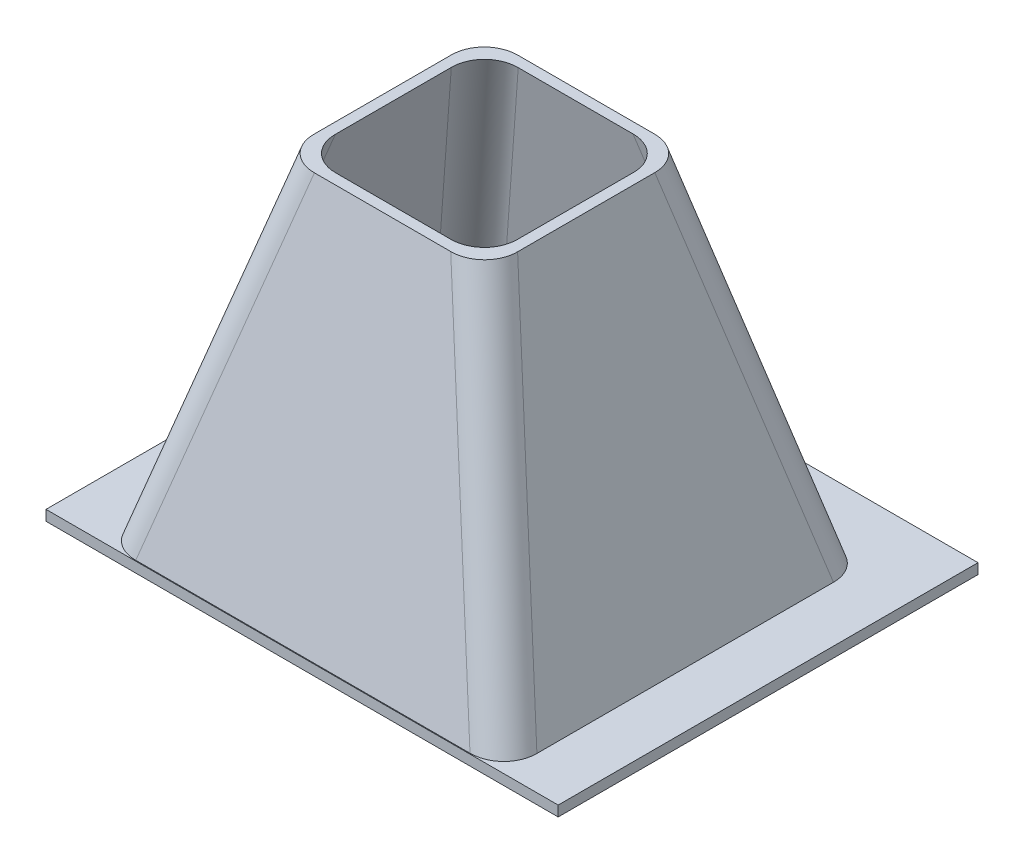
ISO-10303-21;
HEADER;
FILE_DESCRIPTION(('STEP AP214'),'2;1');
FILE_NAME('part.step','',(''),(''),'','','');
FILE_SCHEMA(('AUTOMOTIVE_DESIGN { 1 0 10303 214 1 1 1 1 }'));
ENDSEC;
DATA;
#1=APPLICATION_CONTEXT('core data for automotive mechanical design processes');
#2=APPLICATION_PROTOCOL_DEFINITION('international standard','automotive_design',2000,#1);
#3=PRODUCT_CONTEXT('',#1,'mechanical');
#4=PRODUCT('Part','Part','',(#3));
#5=PRODUCT_RELATED_PRODUCT_CATEGORY('part','',(#4));
#6=PRODUCT_DEFINITION_FORMATION('','',#4);
#7=PRODUCT_DEFINITION_CONTEXT('part definition',#1,'design');
#8=PRODUCT_DEFINITION('design','',#6,#7);
#9=PRODUCT_DEFINITION_SHAPE('','',#8);
#10=(LENGTH_UNIT() NAMED_UNIT(*) SI_UNIT(.MILLI.,.METRE.));
#11=(NAMED_UNIT(*) PLANE_ANGLE_UNIT() SI_UNIT($,.RADIAN.));
#12=(NAMED_UNIT(*) SI_UNIT($,.STERADIAN.) SOLID_ANGLE_UNIT());
#13=UNCERTAINTY_MEASURE_WITH_UNIT(LENGTH_MEASURE(1.E-05),#10,'distance_accuracy_value','');
#14=(GEOMETRIC_REPRESENTATION_CONTEXT(3) GLOBAL_UNCERTAINTY_ASSIGNED_CONTEXT((#13)) GLOBAL_UNIT_ASSIGNED_CONTEXT((#10,
#11,#12)) REPRESENTATION_CONTEXT('',''));
#15=CARTESIAN_POINT('',(0.,0.,0.));
#16=DIRECTION('',(0.,0.,1.));
#17=DIRECTION('',(1.,0.,0.));
#18=AXIS2_PLACEMENT_3D('',#15,#16,#17);
#19=CARTESIAN_POINT('',(0.,0.,0.));
#20=DIRECTION('',(0.,-1.,0.));
#21=DIRECTION('',(0.,0.,-1.));
#22=AXIS2_PLACEMENT_3D('',#19,#20,#21);
#23=PLANE('',#22);
#24=DIRECTION('',(-1.,0.,0.));
#25=VECTOR('',#24,1.);
#26=CARTESIAN_POINT('',(-29.5,0.,-29.5));
#27=LINE('',#26,#25);
#28=CARTESIAN_POINT('',(19.7420424099308,0.,-29.5));
#29=VERTEX_POINT('',#28);
#30=CARTESIAN_POINT('',(-19.7420424099308,0.,-29.5));
#31=VERTEX_POINT('',#30);
#32=EDGE_CURVE('E285',#29,#31,#27,.T.);
#33=ORIENTED_EDGE('',*,*,#32,.T.);
#34=CARTESIAN_POINT('',(-19.097005641384,0.,-19.2369589220661));
#35=DIRECTION('',(0.,-1.,0.));
#36=DIRECTION('',(0.778914652957355,0.,0.627129941406343));
#37=AXIS2_PLACEMENT_3D('',#34,#35,#36);
#38=ELLIPSE('',#37,10.656092332218,10.);
#39=CARTESIAN_POINT('',(-29.5,0.,-19.8733178995071));
#40=VERTEX_POINT('',#39);
#41=EDGE_CURVE('E329',#31,#40,#38,.F.);
#42=ORIENTED_EDGE('',*,*,#41,.T.);
#43=DIRECTION('',(0.,0.,1.));
#44=VECTOR('',#43,1.);
#45=CARTESIAN_POINT('',(-29.5,0.,29.5));
#46=LINE('',#45,#44);
#47=CARTESIAN_POINT('',(-29.5,0.,19.8733178995071));
#48=VERTEX_POINT('',#47);
#49=EDGE_CURVE('E289',#40,#48,#46,.T.);
#50=ORIENTED_EDGE('',*,*,#49,.T.);
#51=CARTESIAN_POINT('',(-19.097005641384,0.,19.2369589220661));
#52=DIRECTION('',(0.,-1.,0.));
#53=DIRECTION('',(0.778914652957355,0.,-0.627129941406343));
#54=AXIS2_PLACEMENT_3D('',#51,#52,#53);
#55=ELLIPSE('',#54,10.656092332218,10.);
#56=CARTESIAN_POINT('',(-19.7420424099308,0.,29.5));
#57=VERTEX_POINT('',#56);
#58=EDGE_CURVE('E320',#48,#57,#55,.F.);
#59=ORIENTED_EDGE('',*,*,#58,.T.);
#60=DIRECTION('',(1.,0.,0.));
#61=VECTOR('',#60,1.);
#62=CARTESIAN_POINT('',(-29.5,0.,29.5));
#63=LINE('',#62,#61);
#64=CARTESIAN_POINT('',(19.7420424099308,0.,29.5));
#65=VERTEX_POINT('',#64);
#66=EDGE_CURVE('E293',#57,#65,#63,.T.);
#67=ORIENTED_EDGE('',*,*,#66,.T.);
#68=CARTESIAN_POINT('',(19.097005641384,0.,19.2369589220661));
#69=DIRECTION('',(0.,-1.,0.));
#70=DIRECTION('',(-0.778914652957355,0.,-0.627129941406343));
#71=AXIS2_PLACEMENT_3D('',#68,#69,#70);
#72=ELLIPSE('',#71,10.656092332218,10.);
#73=CARTESIAN_POINT('',(29.5,0.,19.8733178995071));
#74=VERTEX_POINT('',#73);
#75=EDGE_CURVE('E323',#65,#74,#72,.F.);
#76=ORIENTED_EDGE('',*,*,#75,.T.);
#77=DIRECTION('',(0.,0.,-1.));
#78=VECTOR('',#77,1.);
#79=CARTESIAN_POINT('',(29.5,0.,29.5));
#80=LINE('',#79,#78);
#81=CARTESIAN_POINT('',(29.5,0.,-19.8733178995071));
#82=VERTEX_POINT('',#81);
#83=EDGE_CURVE('E260',#74,#82,#80,.T.);
#84=ORIENTED_EDGE('',*,*,#83,.T.);
#85=CARTESIAN_POINT('',(19.097005641384,0.,-19.2369589220661));
#86=DIRECTION('',(0.,-1.,0.));
#87=DIRECTION('',(-0.778914652957355,0.,0.627129941406343));
#88=AXIS2_PLACEMENT_3D('',#85,#86,#87);
#89=ELLIPSE('',#88,10.656092332218,10.);
#90=EDGE_CURVE('E326',#82,#29,#89,.F.);
#91=ORIENTED_EDGE('',*,*,#90,.T.);
#92=EDGE_LOOP('',(#33,#42,#50,#59,#67,#76,#84,#91));
#93=FACE_BOUND('',#92,.T.);
#94=DIRECTION('',(0.,0.,-1.));
#95=VECTOR('',#94,1.);
#96=CARTESIAN_POINT('',(26.3791016924152,0.,29.5));
#97=LINE('',#96,#95);
#98=CARTESIAN_POINT('',(26.3791016924152,0.,16.7944055761269));
#99=VERTEX_POINT('',#98);
#100=CARTESIAN_POINT('',(26.3791016924152,0.,-16.7944055761269));
#101=VERTEX_POINT('',#100);
#102=EDGE_CURVE('E249',#99,#101,#97,.T.);
#103=ORIENTED_EDGE('',*,*,#102,.F.);
#104=CARTESIAN_POINT('',(15.9761073337992,0.,16.1580465986859));
#105=DIRECTION('',(0.,-1.,0.));
#106=DIRECTION('',(0.778914652957355,0.,0.627129941406343));
#107=AXIS2_PLACEMENT_3D('',#104,#105,#106);
#108=ELLIPSE('',#107,10.656092332218,10.);
#109=CARTESIAN_POINT('',(16.621144102346,0.,26.4210876766198));
#110=VERTEX_POINT('',#109);
#111=EDGE_CURVE('E411',#99,#110,#108,.T.);
#112=ORIENTED_EDGE('',*,*,#111,.T.);
#113=DIRECTION('',(1.,0.,0.));
#114=VECTOR('',#113,1.);
#115=CARTESIAN_POINT('',(-29.5,0.,26.4210876766198));
#116=LINE('',#115,#114);
#117=CARTESIAN_POINT('',(-16.621144102346,0.,26.4210876766198));
#118=VERTEX_POINT('',#117);
#119=EDGE_CURVE('E255',#118,#110,#116,.T.);
#120=ORIENTED_EDGE('',*,*,#119,.F.);
#121=CARTESIAN_POINT('',(-15.9761073337992,0.,16.1580465986859));
#122=DIRECTION('',(0.,-1.,0.));
#123=DIRECTION('',(-0.778914652957355,0.,0.627129941406343));
#124=AXIS2_PLACEMENT_3D('',#121,#122,#123);
#125=ELLIPSE('',#124,10.656092332218,10.);
#126=CARTESIAN_POINT('',(-26.3791016924152,0.,16.7944055761269));
#127=VERTEX_POINT('',#126);
#128=EDGE_CURVE('E48',#118,#127,#125,.T.);
#129=ORIENTED_EDGE('',*,*,#128,.T.);
#130=DIRECTION('',(0.,0.,1.));
#131=VECTOR('',#130,1.);
#132=CARTESIAN_POINT('',(-26.3791016924152,0.,29.5));
#133=LINE('',#132,#131);
#134=CARTESIAN_POINT('',(-26.3791016924152,0.,-16.7944055761269));
#135=VERTEX_POINT('',#134);
#136=EDGE_CURVE('E275',#135,#127,#133,.T.);
#137=ORIENTED_EDGE('',*,*,#136,.F.);
#138=CARTESIAN_POINT('',(-15.9761073337992,0.,-16.1580465986859));
#139=DIRECTION('',(0.,-1.,0.));
#140=DIRECTION('',(-0.778914652957355,0.,-0.627129941406343));
#141=AXIS2_PLACEMENT_3D('',#138,#139,#140);
#142=ELLIPSE('',#141,10.656092332218,10.);
#143=CARTESIAN_POINT('',(-16.621144102346,0.,-26.4210876766198));
#144=VERTEX_POINT('',#143);
#145=EDGE_CURVE('E429',#135,#144,#142,.T.);
#146=ORIENTED_EDGE('',*,*,#145,.T.);
#147=DIRECTION('',(-1.,0.,0.));
#148=VECTOR('',#147,1.);
#149=CARTESIAN_POINT('',(-29.5,0.,-26.4210876766198));
#150=LINE('',#149,#148);
#151=CARTESIAN_POINT('',(16.621144102346,0.,-26.4210876766198));
#152=VERTEX_POINT('',#151);
#153=EDGE_CURVE('E271',#152,#144,#150,.T.);
#154=ORIENTED_EDGE('',*,*,#153,.F.);
#155=CARTESIAN_POINT('',(15.9761073337992,0.,-16.1580465986859));
#156=DIRECTION('',(0.,-1.,0.));
#157=DIRECTION('',(0.778914652957355,0.,-0.627129941406343));
#158=AXIS2_PLACEMENT_3D('',#155,#156,#157);
#159=ELLIPSE('',#158,10.656092332218,10.);
#160=EDGE_CURVE('E423',#152,#101,#159,.T.);
#161=ORIENTED_EDGE('',*,*,#160,.T.);
#162=EDGE_LOOP('',(#103,#112,#120,#129,#137,#146,#154,#161));
#163=FACE_BOUND('',#162,.T.);
#164=ADVANCED_FACE('F39',(#93,#163),#23,.F.);
#165=CARTESIAN_POINT('',(29.5,0.,29.5));
#166=DIRECTION('',(0.961261695938319,0.275637355817,0.));
#167=DIRECTION('',(-0.275637355817,0.961261695938319,0.));
#168=AXIS2_PLACEMENT_3D('',#165,#166,#167);
#169=PLANE('',#168);
#170=DIRECTION('',(0.,0.,-1.));
#171=VECTOR('',#170,1.);
#172=CARTESIAN_POINT('',(58.1745385758809,-100.,29.5));
#173=LINE('',#172,#171);
#174=CARTESIAN_POINT('',(58.1745385758809,-100.,42.9601370120635));
#175=VERTEX_POINT('',#174);
#176=CARTESIAN_POINT('',(58.1745385758809,-100.,-42.9601370120635));
#177=VERTEX_POINT('',#176);
#178=EDGE_CURVE('E297',#175,#177,#173,.T.);
#179=ORIENTED_EDGE('',*,*,#178,.T.);
#180=DIRECTION('',(-0.269090560422278,0.938430307117894,0.216653707501715));
#181=VECTOR('',#180,1.);
#182=CARTESIAN_POINT('',(26.6215618543338,10.0383067648988,-17.5557921747314));
#183=LINE('',#182,#181);
#184=EDGE_CURVE('E342',#177,#82,#183,.T.);
#185=ORIENTED_EDGE('',*,*,#184,.T.);
#186=ORIENTED_EDGE('',*,*,#83,.F.);
#187=DIRECTION('',(-0.269090560422278,0.938430307117894,-0.216653707501715));
#188=VECTOR('',#187,1.);
#189=CARTESIAN_POINT('',(30.0612304409167,-1.95724314597607,20.3251830842115));
#190=LINE('',#189,#188);
#191=EDGE_CURVE('E339',#74,#175,#190,.F.);
#192=ORIENTED_EDGE('',*,*,#191,.T.);
#193=EDGE_LOOP('',(#179,#185,#186,#192));
#194=FACE_BOUND('',#193,.T.);
#195=ADVANCED_FACE('F519',(#194),#169,.T.);
#196=CARTESIAN_POINT('',(-29.5,0.,29.5));
#197=DIRECTION('',(0.,0.224951054343866,0.974370064785235));
#198=DIRECTION('',(0.,-0.974370064785235,0.224951054343866));
#199=AXIS2_PLACEMENT_3D('',#196,#197,#198);
#200=PLANE('',#199);
#201=DIRECTION('',(1.,0.,0.));
#202=VECTOR('',#201,1.);
#203=CARTESIAN_POINT('',(-29.5,-100.,52.5868191125564));
#204=LINE('',#203,#202);
#205=CARTESIAN_POINT('',(-48.4165809858117,-100.,52.5868191125564));
#206=VERTEX_POINT('',#205);
#207=CARTESIAN_POINT('',(48.4165809858117,-100.,52.5868191125564));
#208=VERTEX_POINT('',#207);
#209=EDGE_CURVE('E298',#206,#208,#204,.T.);
#210=ORIENTED_EDGE('',*,*,#209,.T.);
#211=DIRECTION('',(-0.269090560422278,0.938430307117894,-0.216653707501715));
#212=VECTOR('',#211,1.);
#213=CARTESIAN_POINT('',(16.1764394287394,12.4347353376093,26.629215145481));
#214=LINE('',#213,#212);
#215=EDGE_CURVE('E375',#208,#65,#214,.T.);
#216=ORIENTED_EDGE('',*,*,#215,.T.);
#217=ORIENTED_EDGE('',*,*,#66,.F.);
#218=DIRECTION('',(0.269090560422278,0.938430307117894,-0.216653707501715));
#219=VECTOR('',#218,1.);
#220=CARTESIAN_POINT('',(-20.4486134815335,-2.46410616070741,30.0688837320639));
#221=LINE('',#220,#219);
#222=EDGE_CURVE('E372',#57,#206,#221,.F.);
#223=ORIENTED_EDGE('',*,*,#222,.T.);
#224=EDGE_LOOP('',(#210,#216,#217,#223));
#225=FACE_BOUND('',#224,.T.);
#226=ADVANCED_FACE('F525',(#225),#200,.T.);
#227=CARTESIAN_POINT('',(-29.5,0.,29.5));
#228=DIRECTION('',(-0.961261695938319,0.275637355817,0.));
#229=DIRECTION('',(-0.275637355817,-0.961261695938319,0.));
#230=AXIS2_PLACEMENT_3D('',#227,#228,#229);
#231=PLANE('',#230);
#232=ORIENTED_EDGE('',*,*,#49,.F.);
#233=DIRECTION('',(0.269090560422278,0.938430307117894,0.216653707501715));
#234=VECTOR('',#233,1.);
#235=CARTESIAN_POINT('',(-26.6215618543338,10.0383067648988,-17.5557921747314));
#236=LINE('',#235,#234);
#237=CARTESIAN_POINT('',(-58.1745385758809,-100.,-42.9601370120635));
#238=VERTEX_POINT('',#237);
#239=EDGE_CURVE('E336',#40,#238,#236,.F.);
#240=ORIENTED_EDGE('',*,*,#239,.T.);
#241=DIRECTION('',(0.,0.,1.));
#242=VECTOR('',#241,1.);
#243=CARTESIAN_POINT('',(-58.1745385758809,-100.,29.5));
#244=LINE('',#243,#242);
#245=CARTESIAN_POINT('',(-58.1745385758809,-100.,42.9601370120635));
#246=VERTEX_POINT('',#245);
#247=EDGE_CURVE('E303',#238,#246,#244,.T.);
#248=ORIENTED_EDGE('',*,*,#247,.T.);
#249=DIRECTION('',(0.269090560422278,0.938430307117894,-0.216653707501715));
#250=VECTOR('',#249,1.);
#251=CARTESIAN_POINT('',(-30.0612304409167,-1.95724314597607,20.3251830842115));
#252=LINE('',#251,#250);
#253=EDGE_CURVE('E332',#246,#48,#252,.T.);
#254=ORIENTED_EDGE('',*,*,#253,.T.);
#255=EDGE_LOOP('',(#232,#240,#248,#254));
#256=FACE_BOUND('',#255,.T.);
#257=ADVANCED_FACE('F514',(#256),#231,.T.);
#258=CARTESIAN_POINT('',(-29.5,0.,-29.5));
#259=DIRECTION('',(0.,0.224951054343866,-0.974370064785235));
#260=DIRECTION('',(0.,0.974370064785235,0.224951054343866));
#261=AXIS2_PLACEMENT_3D('',#258,#259,#260);
#262=PLANE('',#261);
#263=DIRECTION('',(-1.,0.,0.));
#264=VECTOR('',#263,1.);
#265=CARTESIAN_POINT('',(-29.5,-100.,-52.5868191125564));
#266=LINE('',#265,#264);
#267=CARTESIAN_POINT('',(48.4165809858117,-100.,-52.5868191125564));
#268=VERTEX_POINT('',#267);
#269=CARTESIAN_POINT('',(-48.4165809858116,-100.,-52.5868191125564));
#270=VERTEX_POINT('',#269);
#271=EDGE_CURVE('E304',#268,#270,#266,.T.);
#272=ORIENTED_EDGE('',*,*,#271,.T.);
#273=DIRECTION('',(0.269090560422278,0.938430307117894,0.216653707501715));
#274=VECTOR('',#273,1.);
#275=CARTESIAN_POINT('',(-20.4486134815335,-2.46410616070741,-30.0688837320639));
#276=LINE('',#275,#274);
#277=EDGE_CURVE('E316',#270,#31,#276,.T.);
#278=ORIENTED_EDGE('',*,*,#277,.T.);
#279=ORIENTED_EDGE('',*,*,#32,.F.);
#280=DIRECTION('',(-0.269090560422278,0.938430307117894,0.216653707501715));
#281=VECTOR('',#280,1.);
#282=CARTESIAN_POINT('',(16.1764394287393,12.4347353376093,-26.629215145481));
#283=LINE('',#282,#281);
#284=EDGE_CURVE('E302',#29,#268,#283,.F.);
#285=ORIENTED_EDGE('',*,*,#284,.T.);
#286=EDGE_LOOP('',(#272,#278,#279,#285));
#287=FACE_BOUND('',#286,.T.);
#288=ADVANCED_FACE('F507',(#287),#262,.T.);
#289=CARTESIAN_POINT('',(26.616214912185,-0.826912067450999,29.5));
#290=DIRECTION('',(0.961261695938319,0.275637355817,0.));
#291=DIRECTION('',(-0.275637355817,0.961261695938319,0.));
#292=AXIS2_PLACEMENT_3D('',#289,#290,#291);
#293=PLANE('',#292);
#294=DIRECTION('',(0.,0.,-1.));
#295=VECTOR('',#294,1.);
#296=CARTESIAN_POINT('',(54.1934041110196,-97.,29.5));
#297=LINE('',#296,#295);
#298=CARTESIAN_POINT('',(54.1934041110196,-97.,39.1886201153066));
#299=VERTEX_POINT('',#298);
#300=CARTESIAN_POINT('',(54.1934041110196,-97.,-39.1886201153066));
#301=VERTEX_POINT('',#300);
#302=EDGE_CURVE('E250',#299,#301,#297,.T.);
#303=ORIENTED_EDGE('',*,*,#302,.F.);
#304=DIRECTION('',(-0.269090560422278,0.938430307117894,-0.216653707501715));
#305=VECTOR('',#304,1.);
#306=CARTESIAN_POINT('',(26.9403321333319,-1.95724314597607,17.2462707608313));
#307=LINE('',#306,#305);
#308=EDGE_CURVE('E349',#299,#99,#307,.T.);
#309=ORIENTED_EDGE('',*,*,#308,.T.);
#310=ORIENTED_EDGE('',*,*,#102,.T.);
#311=DIRECTION('',(-0.269090560422278,0.938430307117894,0.216653707501715));
#312=VECTOR('',#311,1.);
#313=CARTESIAN_POINT('',(54.7546345519363,-98.9572431459761,-39.640485300011));
#314=LINE('',#313,#312);
#315=EDGE_CURVE('E346',#101,#301,#314,.F.);
#316=ORIENTED_EDGE('',*,*,#315,.T.);
#317=EDGE_LOOP('',(#303,#309,#310,#316));
#318=FACE_BOUND('',#317,.T.);
#319=ADVANCED_FACE('F505',(#318),#293,.F.);
#320=CARTESIAN_POINT('',(-29.5,-0.674853163031597,26.5768898056443));
#321=DIRECTION('',(0.,0.224951054343866,0.974370064785235));
#322=DIRECTION('',(0.,-0.974370064785235,0.224951054343866));
#323=AXIS2_PLACEMENT_3D('',#320,#321,#322);
#324=PLANE('',#323);
#325=ORIENTED_EDGE('',*,*,#119,.T.);
#326=DIRECTION('',(-0.269090560422278,0.938430307117894,-0.216653707501715));
#327=VECTOR('',#326,1.);
#328=CARTESIAN_POINT('',(45.1420175925531,-99.4641061607074,49.3841859478634));
#329=LINE('',#328,#327);
#330=CARTESIAN_POINT('',(44.4354465209504,-97.,48.8153022157995));
#331=VERTEX_POINT('',#330);
#332=EDGE_CURVE('E357',#110,#331,#329,.F.);
#333=ORIENTED_EDGE('',*,*,#332,.T.);
#334=DIRECTION('',(1.,0.,0.));
#335=VECTOR('',#334,1.);
#336=CARTESIAN_POINT('',(-29.5,-97.,48.8153022157995));
#337=LINE('',#336,#335);
#338=CARTESIAN_POINT('',(-44.4354465209504,-97.,48.8153022157995));
#339=VERTEX_POINT('',#338);
#340=EDGE_CURVE('E256',#339,#331,#337,.T.);
#341=ORIENTED_EDGE('',*,*,#340,.F.);
#342=DIRECTION('',(0.269090560422278,0.938430307117894,-0.216653707501715));
#343=VECTOR('',#342,1.);
#344=CARTESIAN_POINT('',(-17.3277151739487,-2.46410616070741,26.9899714086837));
#345=LINE('',#344,#343);
#346=EDGE_CURVE('E353',#339,#118,#345,.T.);
#347=ORIENTED_EDGE('',*,*,#346,.T.);
#348=EDGE_LOOP('',(#325,#333,#341,#347));
#349=FACE_BOUND('',#348,.T.);
#350=ADVANCED_FACE('F477',(#349),#324,.F.);
#351=CARTESIAN_POINT('',(-26.616214912185,-0.826912067450999,29.5));
#352=DIRECTION('',(-0.961261695938319,0.275637355817,0.));
#353=DIRECTION('',(-0.275637355817,-0.961261695938319,0.));
#354=AXIS2_PLACEMENT_3D('',#351,#352,#353);
#355=PLANE('',#354);
#356=DIRECTION('',(0.,0.,1.));
#357=VECTOR('',#356,1.);
#358=CARTESIAN_POINT('',(-54.1934041110196,-97.,29.5));
#359=LINE('',#358,#357);
#360=CARTESIAN_POINT('',(-54.1934041110196,-97.,-39.1886201153066));
#361=VERTEX_POINT('',#360);
#362=CARTESIAN_POINT('',(-54.1934041110196,-97.,39.1886201153066));
#363=VERTEX_POINT('',#362);
#364=EDGE_CURVE('E261',#361,#363,#359,.T.);
#365=ORIENTED_EDGE('',*,*,#364,.F.);
#366=DIRECTION('',(0.269090560422278,0.938430307117894,0.216653707501715));
#367=VECTOR('',#366,1.);
#368=CARTESIAN_POINT('',(-26.9403321333319,-1.95724314597607,-17.2462707608314));
#369=LINE('',#368,#367);
#370=EDGE_CURVE('E395',#361,#135,#369,.T.);
#371=ORIENTED_EDGE('',*,*,#370,.T.);
#372=ORIENTED_EDGE('',*,*,#136,.T.);
#373=DIRECTION('',(0.269090560422278,0.938430307117894,-0.216653707501715));
#374=VECTOR('',#373,1.);
#375=CARTESIAN_POINT('',(-54.7546345519363,-98.9572431459761,39.640485300011));
#376=LINE('',#375,#374);
#377=EDGE_CURVE('E392',#127,#363,#376,.F.);
#378=ORIENTED_EDGE('',*,*,#377,.T.);
#379=EDGE_LOOP('',(#365,#371,#372,#378));
#380=FACE_BOUND('',#379,.T.);
#381=ADVANCED_FACE('F443',(#380),#355,.F.);
#382=CARTESIAN_POINT('',(-29.5,-0.674853163031597,-26.5768898056443));
#383=DIRECTION('',(0.,0.224951054343866,-0.974370064785235));
#384=DIRECTION('',(0.,0.974370064785235,0.224951054343866));
#385=AXIS2_PLACEMENT_3D('',#382,#383,#384);
#386=PLANE('',#385);
#387=DIRECTION('',(-1.,0.,0.));
#388=VECTOR('',#387,1.);
#389=CARTESIAN_POINT('',(-29.5,-97.,-48.8153022157995));
#390=LINE('',#389,#388);
#391=CARTESIAN_POINT('',(44.4354465209504,-97.,-48.8153022157995));
#392=VERTEX_POINT('',#391);
#393=CARTESIAN_POINT('',(-44.4354465209504,-97.,-48.8153022157995));
#394=VERTEX_POINT('',#393);
#395=EDGE_CURVE('E254',#392,#394,#390,.T.);
#396=ORIENTED_EDGE('',*,*,#395,.F.);
#397=DIRECTION('',(-0.269090560422278,0.938430307117894,0.216653707501715));
#398=VECTOR('',#397,1.);
#399=CARTESIAN_POINT('',(17.3277151739487,-2.46410616070741,-26.9899714086837));
#400=LINE('',#399,#398);
#401=EDGE_CURVE('E382',#392,#152,#400,.T.);
#402=ORIENTED_EDGE('',*,*,#401,.T.);
#403=ORIENTED_EDGE('',*,*,#153,.T.);
#404=DIRECTION('',(0.269090560422278,0.938430307117894,0.216653707501715));
#405=VECTOR('',#404,1.);
#406=CARTESIAN_POINT('',(-45.1420175925531,-99.4641061607074,-49.3841859478634));
#407=LINE('',#406,#405);
#408=EDGE_CURVE('E379',#144,#394,#407,.F.);
#409=ORIENTED_EDGE('',*,*,#408,.T.);
#410=EDGE_LOOP('',(#396,#402,#403,#409));
#411=FACE_BOUND('',#410,.T.);
#412=ADVANCED_FACE('F503',(#411),#386,.F.);
#413=CARTESIAN_POINT('',(-54.1934041110196,-100.001,48.8153022157995));
#414=DIRECTION('',(-1.,0.,0.));
#415=DIRECTION('',(0.,0.,1.));
#416=AXIS2_PLACEMENT_3D('',#413,#414,#415);
#417=PLANE('',#416);
#418=DIRECTION('',(0.,0.,-1.));
#419=VECTOR('',#418,1.);
#420=CARTESIAN_POINT('',(-54.1934041110196,-103.,-48.8153022157995));
#421=LINE('',#420,#419);
#422=CARTESIAN_POINT('',(-54.1934041110196,-103.,46.1108980725865));
#423=VERTEX_POINT('',#422);
#424=CARTESIAN_POINT('',(-54.1934041110196,-103.,-46.1108980725865));
#425=VERTEX_POINT('',#424);
#426=EDGE_CURVE('E450',#423,#425,#421,.T.);
#427=ORIENTED_EDGE('',*,*,#426,.T.);
#428=CARTESIAN_POINT('',(-54.1934041110196,-133.279552785433,-46.9280558642829));
#429=DIRECTION('',(-1.,0.,0.));
#430=DIRECTION('',(0.,-0.974370064785235,-0.224951054343866));
#431=AXIS2_PLACEMENT_3D('',#428,#429,#430);
#432=ELLIPSE('',#431,37.1622103142794,10.);
#433=EDGE_CURVE('E402',#425,#361,#432,.F.);
#434=ORIENTED_EDGE('',*,*,#433,.T.);
#435=ORIENTED_EDGE('',*,*,#364,.T.);
#436=CARTESIAN_POINT('',(-54.1934041110196,-133.279552785433,46.9280558642829));
#437=DIRECTION('',(-1.,0.,0.));
#438=DIRECTION('',(0.,-0.974370064785235,0.224951054343866));
#439=AXIS2_PLACEMENT_3D('',#436,#437,#438);
#440=ELLIPSE('',#439,37.1622103142794,10.);
#441=EDGE_CURVE('E399',#363,#423,#440,.F.);
#442=ORIENTED_EDGE('',*,*,#441,.T.);
#443=EDGE_LOOP('',(#427,#434,#435,#442));
#444=FACE_BOUND('',#443,.T.);
#445=ADVANCED_FACE('F449',(#444),#417,.F.);
#446=CARTESIAN_POINT('',(54.1934041110196,-100.001,-48.8153022157995));
#447=DIRECTION('',(0.,0.,-1.));
#448=DIRECTION('',(-1.,0.,0.));
#449=AXIS2_PLACEMENT_3D('',#446,#447,#448);
#450=PLANE('',#449);
#451=DIRECTION('',(1.,0.,0.));
#452=VECTOR('',#451,1.);
#453=CARTESIAN_POINT('',(54.1934041110196,-103.,-48.8153022157995));
#454=LINE('',#453,#452);
#455=CARTESIAN_POINT('',(-51.2782180044527,-103.,-48.8153022157995));
#456=VERTEX_POINT('',#455);
#457=CARTESIAN_POINT('',(51.2782180044528,-103.,-48.8153022157995));
#458=VERTEX_POINT('',#457);
#459=EDGE_CURVE('E455',#456,#458,#454,.T.);
#460=ORIENTED_EDGE('',*,*,#459,.T.);
#461=CARTESIAN_POINT('',(56.5374220567106,-141.454114825858,-48.8153022157995));
#462=DIRECTION('',(0.,0.,-1.));
#463=DIRECTION('',(0.275637355817,-0.961261695938319,0.));
#464=AXIS2_PLACEMENT_3D('',#461,#462,#463);
#465=ELLIPSE('',#464,46.1566068511466,10.);
#466=EDGE_CURVE('E389',#458,#392,#465,.F.);
#467=ORIENTED_EDGE('',*,*,#466,.T.);
#468=ORIENTED_EDGE('',*,*,#395,.T.);
#469=CARTESIAN_POINT('',(-56.5374220567106,-141.454114825858,-48.8153022157995));
#470=DIRECTION('',(0.,0.,-1.));
#471=DIRECTION('',(-0.275637355817,-0.961261695938319,0.));
#472=AXIS2_PLACEMENT_3D('',#469,#470,#471);
#473=ELLIPSE('',#472,46.1566068511466,10.);
#474=EDGE_CURVE('E386',#394,#456,#473,.F.);
#475=ORIENTED_EDGE('',*,*,#474,.T.);
#476=EDGE_LOOP('',(#460,#467,#468,#475));
#477=FACE_BOUND('',#476,.T.);
#478=ADVANCED_FACE('F495',(#477),#450,.F.);
#479=CARTESIAN_POINT('',(54.1934041110196,-100.001,48.8153022157995));
#480=DIRECTION('',(1.,0.,0.));
#481=DIRECTION('',(0.,0.,-1.));
#482=AXIS2_PLACEMENT_3D('',#479,#480,#481);
#483=PLANE('',#482);
#484=DIRECTION('',(0.,0.,1.));
#485=VECTOR('',#484,1.);
#486=CARTESIAN_POINT('',(54.1934041110196,-103.,-48.8153022157995));
#487=LINE('',#486,#485);
#488=CARTESIAN_POINT('',(54.1934041110196,-103.,-46.1108980725865));
#489=VERTEX_POINT('',#488);
#490=CARTESIAN_POINT('',(54.1934041110196,-103.,46.1108980725865));
#491=VERTEX_POINT('',#490);
#492=EDGE_CURVE('E461',#489,#491,#487,.T.);
#493=ORIENTED_EDGE('',*,*,#492,.T.);
#494=CARTESIAN_POINT('',(54.1934041110196,-133.279552785433,46.9280558642829));
#495=DIRECTION('',(1.,0.,0.));
#496=DIRECTION('',(0.,-0.974370064785235,0.224951054343866));
#497=AXIS2_PLACEMENT_3D('',#494,#495,#496);
#498=ELLIPSE('',#497,37.1622103142794,10.);
#499=EDGE_CURVE('E369',#491,#299,#498,.F.);
#500=ORIENTED_EDGE('',*,*,#499,.T.);
#501=ORIENTED_EDGE('',*,*,#302,.T.);
#502=CARTESIAN_POINT('',(54.1934041110196,-133.279552785433,-46.9280558642829));
#503=DIRECTION('',(1.,0.,0.));
#504=DIRECTION('',(0.,-0.974370064785235,-0.224951054343866));
#505=AXIS2_PLACEMENT_3D('',#502,#503,#504);
#506=ELLIPSE('',#505,37.1622103142794,10.);
#507=EDGE_CURVE('E366',#301,#489,#506,.F.);
#508=ORIENTED_EDGE('',*,*,#507,.T.);
#509=EDGE_LOOP('',(#493,#500,#501,#508));
#510=FACE_BOUND('',#509,.T.);
#511=ADVANCED_FACE('F486',(#510),#483,.F.);
#512=CARTESIAN_POINT('',(54.1934041110196,-100.001,48.8153022157995));
#513=DIRECTION('',(0.,0.,1.));
#514=DIRECTION('',(1.,0.,0.));
#515=AXIS2_PLACEMENT_3D('',#512,#513,#514);
#516=PLANE('',#515);
#517=ORIENTED_EDGE('',*,*,#340,.T.);
#518=CARTESIAN_POINT('',(56.5374220567106,-141.454114825858,48.8153022157995));
#519=DIRECTION('',(0.,0.,1.));
#520=DIRECTION('',(0.275637355817,-0.961261695938319,0.));
#521=AXIS2_PLACEMENT_3D('',#518,#519,#520);
#522=ELLIPSE('',#521,46.1566068511466,10.);
#523=CARTESIAN_POINT('',(51.2782180044528,-103.,48.8153022157995));
#524=VERTEX_POINT('',#523);
#525=EDGE_CURVE('E363',#331,#524,#522,.F.);
#526=ORIENTED_EDGE('',*,*,#525,.T.);
#527=DIRECTION('',(-1.,0.,0.));
#528=VECTOR('',#527,1.);
#529=CARTESIAN_POINT('',(54.1934041110196,-103.,48.8153022157995));
#530=LINE('',#529,#528);
#531=CARTESIAN_POINT('',(-51.2782180044527,-103.,48.8153022157995));
#532=VERTEX_POINT('',#531);
#533=EDGE_CURVE('E239',#524,#532,#530,.T.);
#534=ORIENTED_EDGE('',*,*,#533,.T.);
#535=CARTESIAN_POINT('',(-56.5374220567106,-141.454114825858,48.8153022157995));
#536=DIRECTION('',(0.,0.,1.));
#537=DIRECTION('',(-0.275637355817,-0.961261695938319,0.));
#538=AXIS2_PLACEMENT_3D('',#535,#536,#537);
#539=ELLIPSE('',#538,46.1566068511466,10.);
#540=EDGE_CURVE('E360',#532,#339,#539,.F.);
#541=ORIENTED_EDGE('',*,*,#540,.T.);
#542=EDGE_LOOP('',(#517,#526,#534,#541));
#543=FACE_BOUND('',#542,.T.);
#544=ADVANCED_FACE('F472',(#543),#516,.F.);
#545=CARTESIAN_POINT('',(0.,-100.,0.));
#546=DIRECTION('',(0.,1.,0.));
#547=DIRECTION('',(0.,0.,1.));
#548=AXIS2_PLACEMENT_3D('',#545,#546,#547);
#549=PLANE('',#548);
#550=DIRECTION('',(1.,0.,0.));
#551=VECTOR('',#550,1.);
#552=CARTESIAN_POINT('',(-74.1934041110196,-100.,52.8153022157995));
#553=LINE('',#552,#551);
#554=CARTESIAN_POINT('',(-74.1934041110196,-100.,52.8153022157995));
#555=VERTEX_POINT('',#554);
#556=CARTESIAN_POINT('',(74.1934041110196,-100.,52.8153022157995));
#557=VERTEX_POINT('',#556);
#558=EDGE_CURVE('E55',#555,#557,#553,.T.);
#559=ORIENTED_EDGE('',*,*,#558,.T.);
#560=DIRECTION('',(0.,0.,1.));
#561=VECTOR('',#560,1.);
#562=CARTESIAN_POINT('',(74.1934041110196,-100.,-68.8153022157995));
#563=LINE('',#562,#561);
#564=CARTESIAN_POINT('',(74.1934041110196,-100.,-68.8153022157995));
#565=VERTEX_POINT('',#564);
#566=EDGE_CURVE('E234',#565,#557,#563,.T.);
#567=ORIENTED_EDGE('',*,*,#566,.F.);
#568=DIRECTION('',(1.,0.,0.));
#569=VECTOR('',#568,1.);
#570=CARTESIAN_POINT('',(-74.1934041110196,-100.,-68.8153022157995));
#571=LINE('',#570,#569);
#572=CARTESIAN_POINT('',(-74.1934041110196,-100.,-68.8153022157995));
#573=VERTEX_POINT('',#572);
#574=EDGE_CURVE('E230',#573,#565,#571,.T.);
#575=ORIENTED_EDGE('',*,*,#574,.F.);
#576=DIRECTION('',(0.,0.,-1.));
#577=VECTOR('',#576,1.);
#578=CARTESIAN_POINT('',(-74.1934041110196,-100.,-68.8153022157995));
#579=LINE('',#578,#577);
#580=EDGE_CURVE('E238',#555,#573,#579,.T.);
#581=ORIENTED_EDGE('',*,*,#580,.F.);
#582=EDGE_LOOP('',(#559,#567,#575,#581));
#583=FACE_BOUND('',#582,.T.);
#584=CARTESIAN_POINT('',(0.,-100.,-57.8153022157995));
#585=DIRECTION('',(0.,1.,0.));
#586=DIRECTION('',(0.,0.,1.));
#587=AXIS2_PLACEMENT_3D('',#584,#585,#586);
#588=CIRCLE('',#587,3.5);
#589=CARTESIAN_POINT('',(0.,-100.,-54.3153022157995));
#590=VERTEX_POINT('',#589);
#591=EDGE_CURVE('E464',#590,#590,#588,.T.);
#592=ORIENTED_EDGE('',*,*,#591,.F.);
#593=EDGE_LOOP('',(#592));
#594=FACE_BOUND('',#593,.T.);
#595=ORIENTED_EDGE('',*,*,#178,.F.);
#596=CARTESIAN_POINT('',(47.7715442172648,-100.,42.3237780346224));
#597=DIRECTION('',(0.,1.,0.));
#598=DIRECTION('',(-0.778914652957355,0.,-0.627129941406343));
#599=AXIS2_PLACEMENT_3D('',#596,#597,#598);
#600=ELLIPSE('',#599,10.656092332218,10.);
#601=EDGE_CURVE('E417',#175,#208,#600,.F.);
#602=ORIENTED_EDGE('',*,*,#601,.T.);
#603=ORIENTED_EDGE('',*,*,#209,.F.);
#604=CARTESIAN_POINT('',(-47.7715442172648,-100.,42.3237780346224));
#605=DIRECTION('',(0.,1.,0.));
#606=DIRECTION('',(0.778914652957355,0.,-0.627129941406343));
#607=AXIS2_PLACEMENT_3D('',#604,#605,#606);
#608=ELLIPSE('',#607,10.656092332218,10.);
#609=EDGE_CURVE('E420',#206,#246,#608,.F.);
#610=ORIENTED_EDGE('',*,*,#609,.T.);
#611=ORIENTED_EDGE('',*,*,#247,.F.);
#612=CARTESIAN_POINT('',(-47.7715442172648,-100.,-42.3237780346224));
#613=DIRECTION('',(0.,1.,0.));
#614=DIRECTION('',(0.778914652957355,0.,0.627129941406343));
#615=AXIS2_PLACEMENT_3D('',#612,#613,#614);
#616=ELLIPSE('',#615,10.656092332218,10.);
#617=EDGE_CURVE('E405',#238,#270,#616,.F.);
#618=ORIENTED_EDGE('',*,*,#617,.T.);
#619=ORIENTED_EDGE('',*,*,#271,.F.);
#620=CARTESIAN_POINT('',(47.7715442172648,-100.,-42.3237780346225));
#621=DIRECTION('',(0.,1.,0.));
#622=DIRECTION('',(-0.778914652957355,0.,0.627129941406343));
#623=AXIS2_PLACEMENT_3D('',#620,#621,#622);
#624=ELLIPSE('',#623,10.656092332218,10.);
#625=EDGE_CURVE('E408',#268,#177,#624,.F.);
#626=ORIENTED_EDGE('',*,*,#625,.T.);
#627=EDGE_LOOP('',(#595,#602,#603,#610,#611,#618,#619,#626));
#628=FACE_BOUND('',#627,.T.);
#629=ADVANCED_FACE('F577',(#583,#594,#628),#549,.T.);
#630=CARTESIAN_POINT('',(0.,-103.,0.));
#631=DIRECTION('',(0.,1.,0.));
#632=DIRECTION('',(0.,0.,1.));
#633=AXIS2_PLACEMENT_3D('',#630,#631,#632);
#634=PLANE('',#633);
#635=CARTESIAN_POINT('',(0.,-103.,-57.8153022157995));
#636=DIRECTION('',(0.,1.,0.));
#637=DIRECTION('',(0.,0.,1.));
#638=AXIS2_PLACEMENT_3D('',#635,#636,#637);
#639=CIRCLE('',#638,3.5);
#640=CARTESIAN_POINT('',(0.,-103.,-54.3153022157995));
#641=VERTEX_POINT('',#640);
#642=EDGE_CURVE('E456',#641,#641,#639,.T.);
#643=ORIENTED_EDGE('',*,*,#642,.T.);
#644=EDGE_LOOP('',(#643));
#645=FACE_BOUND('',#644,.T.);
#646=DIRECTION('',(0.,0.,1.));
#647=VECTOR('',#646,1.);
#648=CARTESIAN_POINT('',(74.1934041110196,-103.,-68.8153022157995));
#649=LINE('',#648,#647);
#650=CARTESIAN_POINT('',(74.1934041110196,-103.,-68.8153022157995));
#651=VERTEX_POINT('',#650);
#652=CARTESIAN_POINT('',(74.1934041110196,-103.,52.8153022157995));
#653=VERTEX_POINT('',#652);
#654=EDGE_CURVE('E216',#651,#653,#649,.T.);
#655=ORIENTED_EDGE('',*,*,#654,.T.);
#656=DIRECTION('',(1.,0.,0.));
#657=VECTOR('',#656,1.);
#658=CARTESIAN_POINT('',(-74.1934041110196,-103.,52.8153022157995));
#659=LINE('',#658,#657);
#660=CARTESIAN_POINT('',(-74.1934041110196,-103.,52.8153022157995));
#661=VERTEX_POINT('',#660);
#662=EDGE_CURVE('E202',#661,#653,#659,.T.);
#663=ORIENTED_EDGE('',*,*,#662,.F.);
#664=DIRECTION('',(0.,0.,-1.));
#665=VECTOR('',#664,1.);
#666=CARTESIAN_POINT('',(-74.1934041110196,-103.,-68.8153022157995));
#667=LINE('',#666,#665);
#668=CARTESIAN_POINT('',(-74.1934041110196,-103.,-68.8153022157995));
#669=VERTEX_POINT('',#668);
#670=EDGE_CURVE('E213',#661,#669,#667,.T.);
#671=ORIENTED_EDGE('',*,*,#670,.T.);
#672=DIRECTION('',(1.,0.,0.));
#673=VECTOR('',#672,1.);
#674=CARTESIAN_POINT('',(-74.1934041110196,-103.,-68.8153022157995));
#675=LINE('',#674,#673);
#676=EDGE_CURVE('E224',#669,#651,#675,.T.);
#677=ORIENTED_EDGE('',*,*,#676,.T.);
#678=EDGE_LOOP('',(#655,#663,#671,#677));
#679=FACE_BOUND('',#678,.T.);
#680=ORIENTED_EDGE('',*,*,#426,.F.);
#681=CARTESIAN_POINT('',(-45.5108820669564,-103.,39.937470284619));
#682=DIRECTION('',(0.,1.,0.));
#683=DIRECTION('',(-0.778914652957355,0.,0.627129941406343));
#684=AXIS2_PLACEMENT_3D('',#681,#682,#683);
#685=ELLIPSE('',#684,10.656092332218,10.);
#686=EDGE_CURVE('E11',#423,#532,#685,.T.);
#687=ORIENTED_EDGE('',*,*,#686,.T.);
#688=ORIENTED_EDGE('',*,*,#533,.F.);
#689=CARTESIAN_POINT('',(45.5108820669565,-103.,39.937470284619));
#690=DIRECTION('',(0.,1.,0.));
#691=DIRECTION('',(0.778914652957355,0.,0.627129941406343));
#692=AXIS2_PLACEMENT_3D('',#689,#690,#691);
#693=ELLIPSE('',#692,10.656092332218,10.);
#694=EDGE_CURVE('E414',#524,#491,#693,.T.);
#695=ORIENTED_EDGE('',*,*,#694,.T.);
#696=ORIENTED_EDGE('',*,*,#492,.F.);
#697=CARTESIAN_POINT('',(45.5108820669565,-103.,-39.937470284619));
#698=DIRECTION('',(0.,1.,0.));
#699=DIRECTION('',(0.778914652957355,0.,-0.627129941406343));
#700=AXIS2_PLACEMENT_3D('',#697,#698,#699);
#701=ELLIPSE('',#700,10.656092332218,10.);
#702=EDGE_CURVE('E426',#489,#458,#701,.T.);
#703=ORIENTED_EDGE('',*,*,#702,.T.);
#704=ORIENTED_EDGE('',*,*,#459,.F.);
#705=CARTESIAN_POINT('',(-45.5108820669564,-103.,-39.937470284619));
#706=DIRECTION('',(0.,1.,0.));
#707=DIRECTION('',(-0.778914652957355,0.,-0.627129941406343));
#708=AXIS2_PLACEMENT_3D('',#705,#706,#707);
#709=ELLIPSE('',#708,10.656092332218,10.);
#710=EDGE_CURVE('E63',#456,#425,#709,.T.);
#711=ORIENTED_EDGE('',*,*,#710,.T.);
#712=EDGE_LOOP('',(#680,#687,#688,#695,#696,#703,#704,#711));
#713=FACE_BOUND('',#712,.T.);
#714=ADVANCED_FACE('F212',(#645,#679,#713),#634,.F.);
#715=CARTESIAN_POINT('',(74.1934041110196,-103.,-68.8153022157995));
#716=DIRECTION('',(-1.,0.,0.));
#717=DIRECTION('',(0.,0.,1.));
#718=AXIS2_PLACEMENT_3D('',#715,#716,#717);
#719=PLANE('',#718);
#720=ORIENTED_EDGE('',*,*,#566,.T.);
#721=DIRECTION('',(0.,-1.,0.));
#722=VECTOR('',#721,1.);
#723=CARTESIAN_POINT('',(74.1934041110196,0.001000000000001,52.8153022157995));
#724=LINE('',#723,#722);
#725=EDGE_CURVE('E208',#557,#653,#724,.T.);
#726=ORIENTED_EDGE('',*,*,#725,.T.);
#727=ORIENTED_EDGE('',*,*,#654,.F.);
#728=DIRECTION('',(0.,1.,0.));
#729=VECTOR('',#728,1.);
#730=CARTESIAN_POINT('',(74.1934041110196,-103.,-68.8153022157995));
#731=LINE('',#730,#729);
#732=EDGE_CURVE('E228',#651,#565,#731,.T.);
#733=ORIENTED_EDGE('',*,*,#732,.T.);
#734=EDGE_LOOP('',(#720,#726,#727,#733));
#735=FACE_BOUND('',#734,.T.);
#736=ADVANCED_FACE('F576',(#735),#719,.F.);
#737=CARTESIAN_POINT('',(-74.1934041110196,-103.,-68.8153022157995));
#738=DIRECTION('',(1.,0.,0.));
#739=DIRECTION('',(0.,0.,-1.));
#740=AXIS2_PLACEMENT_3D('',#737,#738,#739);
#741=PLANE('',#740);
#742=ORIENTED_EDGE('',*,*,#670,.F.);
#743=DIRECTION('',(0.,-1.,0.));
#744=VECTOR('',#743,1.);
#745=CARTESIAN_POINT('',(-74.1934041110196,0.001000000000001,52.8153022157995));
#746=LINE('',#745,#744);
#747=EDGE_CURVE('E199',#555,#661,#746,.T.);
#748=ORIENTED_EDGE('',*,*,#747,.F.);
#749=ORIENTED_EDGE('',*,*,#580,.T.);
#750=DIRECTION('',(0.,1.,0.));
#751=VECTOR('',#750,1.);
#752=CARTESIAN_POINT('',(-74.1934041110196,-103.,-68.8153022157995));
#753=LINE('',#752,#751);
#754=EDGE_CURVE('E221',#669,#573,#753,.T.);
#755=ORIENTED_EDGE('',*,*,#754,.F.);
#756=EDGE_LOOP('',(#742,#748,#749,#755));
#757=FACE_BOUND('',#756,.T.);
#758=ADVANCED_FACE('F219',(#757),#741,.F.);
#759=CARTESIAN_POINT('',(-74.1934041110196,-103.,-68.8153022157995));
#760=DIRECTION('',(0.,0.,1.));
#761=DIRECTION('',(1.,0.,0.));
#762=AXIS2_PLACEMENT_3D('',#759,#760,#761);
#763=PLANE('',#762);
#764=ORIENTED_EDGE('',*,*,#574,.T.);
#765=ORIENTED_EDGE('',*,*,#732,.F.);
#766=ORIENTED_EDGE('',*,*,#676,.F.);
#767=ORIENTED_EDGE('',*,*,#754,.T.);
#768=EDGE_LOOP('',(#764,#765,#766,#767));
#769=FACE_BOUND('',#768,.T.);
#770=ADVANCED_FACE('F541',(#769),#763,.F.);
#771=CARTESIAN_POINT('',(-20.4486134815335,-4.71361670414606,-20.3251830842115));
#772=DIRECTION('',(0.269090560422278,0.938430307117894,0.216653707501715));
#773=DIRECTION('',(-0.961261695938319,0.275637355817,0.));
#774=AXIS2_PLACEMENT_3D('',#771,#772,#773);
#775=CYLINDRICAL_SURFACE('',#774,10.);
#776=ORIENTED_EDGE('',*,*,#617,.F.);
#777=ORIENTED_EDGE('',*,*,#239,.F.);
#778=ORIENTED_EDGE('',*,*,#41,.F.);
#779=ORIENTED_EDGE('',*,*,#277,.F.);
#780=EDGE_LOOP('',(#776,#777,#778,#779));
#781=FACE_BOUND('',#780,.T.);
#782=ADVANCED_FACE('F537',(#781),#775,.T.);
#783=CARTESIAN_POINT('',(17.0089448949507,7.28193320672879,-17.5557921747314));
#784=DIRECTION('',(-0.269090560422278,0.938430307117894,0.216653707501715));
#785=DIRECTION('',(-0.961261695938319,-0.275637355817,0.));
#786=AXIS2_PLACEMENT_3D('',#783,#784,#785);
#787=CYLINDRICAL_SURFACE('',#786,10.);
#788=ORIENTED_EDGE('',*,*,#625,.F.);
#789=ORIENTED_EDGE('',*,*,#284,.F.);
#790=ORIENTED_EDGE('',*,*,#90,.F.);
#791=ORIENTED_EDGE('',*,*,#184,.F.);
#792=EDGE_LOOP('',(#788,#789,#790,#791));
#793=FACE_BOUND('',#792,.T.);
#794=ADVANCED_FACE('F540',(#793),#787,.T.);
#795=CARTESIAN_POINT('',(17.7331975259936,-6.12770171538988,17.572738009475));
#796=DIRECTION('',(0.269090560422278,-0.938430307117894,0.216653707501715));
#797=DIRECTION('',(0.961261695938319,0.275637355817,0.));
#798=AXIS2_PLACEMENT_3D('',#795,#796,#797);
#799=CYLINDRICAL_SURFACE('',#798,10.);
#800=ORIENTED_EDGE('',*,*,#525,.F.);
#801=ORIENTED_EDGE('',*,*,#332,.F.);
#802=ORIENTED_EDGE('',*,*,#111,.F.);
#803=ORIENTED_EDGE('',*,*,#308,.F.);
#804=ORIENTED_EDGE('',*,*,#499,.F.);
#805=ORIENTED_EDGE('',*,*,#694,.F.);
#806=EDGE_LOOP('',(#800,#801,#802,#803,#804,#805));
#807=FACE_BOUND('',#806,.T.);
#808=ADVANCED_FACE('F480',(#807),#799,.F.);
#809=CARTESIAN_POINT('',(16.1764394287394,10.1852247941706,16.8855144976287));
#810=DIRECTION('',(-0.269090560422278,0.938430307117894,-0.216653707501715));
#811=DIRECTION('',(-0.961261695938319,-0.275637355817,0.));
#812=AXIS2_PLACEMENT_3D('',#809,#810,#811);
#813=CYLINDRICAL_SURFACE('',#812,10.);
#814=ORIENTED_EDGE('',*,*,#601,.F.);
#815=ORIENTED_EDGE('',*,*,#191,.F.);
#816=ORIENTED_EDGE('',*,*,#75,.F.);
#817=ORIENTED_EDGE('',*,*,#215,.F.);
#818=EDGE_LOOP('',(#814,#815,#816,#817));
#819=FACE_BOUND('',#818,.T.);
#820=ADVANCED_FACE('F548',(#819),#813,.T.);
#821=CARTESIAN_POINT('',(-20.4486134815335,-4.71361670414606,20.3251830842115));
#822=DIRECTION('',(0.269090560422278,0.938430307117894,-0.216653707501715));
#823=DIRECTION('',(-0.961261695938319,0.275637355817,0.));
#824=AXIS2_PLACEMENT_3D('',#821,#822,#823);
#825=CYLINDRICAL_SURFACE('',#824,10.);
#826=ORIENTED_EDGE('',*,*,#609,.F.);
#827=ORIENTED_EDGE('',*,*,#222,.F.);
#828=ORIENTED_EDGE('',*,*,#58,.F.);
#829=ORIENTED_EDGE('',*,*,#253,.F.);
#830=EDGE_LOOP('',(#826,#827,#828,#829));
#831=FACE_BOUND('',#830,.T.);
#832=ADVANCED_FACE('F551',(#831),#825,.T.);
#833=CARTESIAN_POINT('',(13.4610234731994,8.77113978292678,-14.1330694228921));
#834=DIRECTION('',(0.269090560422278,-0.938430307117894,-0.216653707501715));
#835=DIRECTION('',(0.961261695938319,0.275637355817,0.));
#836=AXIS2_PLACEMENT_3D('',#833,#834,#835);
#837=CYLINDRICAL_SURFACE('',#836,10.);
#838=ORIENTED_EDGE('',*,*,#507,.F.);
#839=ORIENTED_EDGE('',*,*,#315,.F.);
#840=ORIENTED_EDGE('',*,*,#160,.F.);
#841=ORIENTED_EDGE('',*,*,#401,.F.);
#842=ORIENTED_EDGE('',*,*,#466,.F.);
#843=ORIENTED_EDGE('',*,*,#702,.F.);
#844=EDGE_LOOP('',(#838,#839,#840,#841,#842,#843));
#845=FACE_BOUND('',#844,.T.);
#846=ADVANCED_FACE('F491',(#845),#837,.F.);
#847=CARTESIAN_POINT('',(-14.2935289394107,5.86784819548497,-14.8033470999949));
#848=DIRECTION('',(-0.269090560422278,-0.938430307117894,-0.216653707501715));
#849=DIRECTION('',(0.961261695938319,-0.275637355817,0.));
#850=AXIS2_PLACEMENT_3D('',#847,#848,#849);
#851=CYLINDRICAL_SURFACE('',#850,10.);
#852=ORIENTED_EDGE('',*,*,#474,.F.);
#853=ORIENTED_EDGE('',*,*,#408,.F.);
#854=ORIENTED_EDGE('',*,*,#145,.F.);
#855=ORIENTED_EDGE('',*,*,#370,.F.);
#856=ORIENTED_EDGE('',*,*,#433,.F.);
#857=ORIENTED_EDGE('',*,*,#710,.F.);
#858=EDGE_LOOP('',(#852,#853,#854,#855,#856,#857));
#859=FACE_BOUND('',#858,.T.);
#860=ADVANCED_FACE('F500',(#859),#851,.F.);
#861=CARTESIAN_POINT('',(-17.7331975259935,-6.12770171538988,17.572738009475));
#862=DIRECTION('',(-0.269090560422278,-0.938430307117894,0.216653707501715));
#863=DIRECTION('',(0.961261695938319,-0.275637355817,0.));
#864=AXIS2_PLACEMENT_3D('',#861,#862,#863);
#865=CYLINDRICAL_SURFACE('',#864,10.);
#866=ORIENTED_EDGE('',*,*,#441,.F.);
#867=ORIENTED_EDGE('',*,*,#377,.F.);
#868=ORIENTED_EDGE('',*,*,#128,.F.);
#869=ORIENTED_EDGE('',*,*,#346,.F.);
#870=ORIENTED_EDGE('',*,*,#540,.F.);
#871=ORIENTED_EDGE('',*,*,#686,.F.);
#872=EDGE_LOOP('',(#866,#867,#868,#869,#870,#871));
#873=FACE_BOUND('',#872,.T.);
#874=ADVANCED_FACE('F41',(#873),#865,.F.);
#875=CARTESIAN_POINT('',(0.,-103.,-57.8153022157995));
#876=DIRECTION('',(0.,1.,0.));
#877=DIRECTION('',(0.,0.,1.));
#878=AXIS2_PLACEMENT_3D('',#875,#876,#877);
#879=CYLINDRICAL_SURFACE('',#878,3.5);
#880=ORIENTED_EDGE('',*,*,#642,.F.);
#881=EDGE_LOOP('',(#880));
#882=FACE_BOUND('',#881,.T.);
#883=ORIENTED_EDGE('',*,*,#591,.T.);
#884=EDGE_LOOP('',(#883));
#885=FACE_BOUND('',#884,.T.);
#886=ADVANCED_FACE('F561',(#882,#885),#879,.F.);
#887=CARTESIAN_POINT('',(-74.1934041110196,0.001000000000001,52.8153022157995));
#888=DIRECTION('',(0.,0.,-1.));
#889=DIRECTION('',(-1.,0.,0.));
#890=AXIS2_PLACEMENT_3D('',#887,#888,#889);
#891=PLANE('',#890);
#892=ORIENTED_EDGE('',*,*,#747,.T.);
#893=ORIENTED_EDGE('',*,*,#662,.T.);
#894=ORIENTED_EDGE('',*,*,#725,.F.);
#895=ORIENTED_EDGE('',*,*,#558,.F.);
#896=EDGE_LOOP('',(#892,#893,#894,#895));
#897=FACE_BOUND('',#896,.T.);
#898=ADVANCED_FACE('F201',(#897),#891,.F.);
#899=CLOSED_SHELL('',(#164,#195,#226,#257,#288,#319,#350,#381,#412,#445,#478,#511,#544,#629,
#714,#736,#758,#770,#782,#794,#808,#820,#832,#846,#860,#874,#886,#898));
#900=MANIFOLD_SOLID_BREP('B2',#899);
#901=ADVANCED_BREP_SHAPE_REPRESENTATION('',(#18,#900),#14);
#902=SHAPE_DEFINITION_REPRESENTATION(#9,#901);
ENDSEC;
END-ISO-10303-21;
